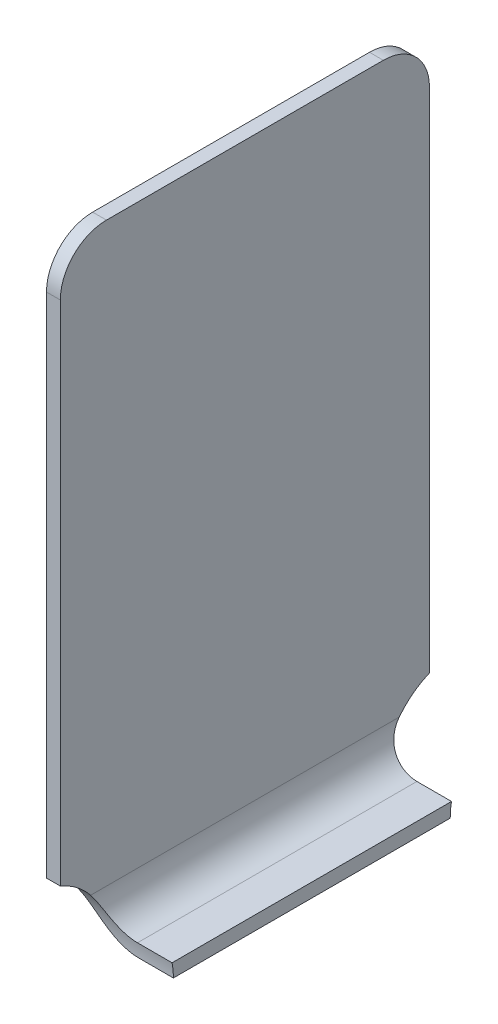
ISO-10303-21;
HEADER;
FILE_DESCRIPTION(('STEP AP214'),'2;1');
FILE_NAME('part.step','',(''),(''),'','','');
FILE_SCHEMA(('AUTOMOTIVE_DESIGN { 1 0 10303 214 1 1 1 1 }'));
ENDSEC;
DATA;
#1=APPLICATION_CONTEXT('core data for automotive mechanical design processes');
#2=APPLICATION_PROTOCOL_DEFINITION('international standard','automotive_design',2000,#1);
#3=PRODUCT_CONTEXT('',#1,'mechanical');
#4=PRODUCT('Part','Part','',(#3));
#5=PRODUCT_RELATED_PRODUCT_CATEGORY('part','',(#4));
#6=PRODUCT_DEFINITION_FORMATION('','',#4);
#7=PRODUCT_DEFINITION_CONTEXT('part definition',#1,'design');
#8=PRODUCT_DEFINITION('design','',#6,#7);
#9=PRODUCT_DEFINITION_SHAPE('','',#8);
#10=(LENGTH_UNIT() NAMED_UNIT(*) SI_UNIT(.MILLI.,.METRE.));
#11=(NAMED_UNIT(*) PLANE_ANGLE_UNIT() SI_UNIT($,.RADIAN.));
#12=(NAMED_UNIT(*) SI_UNIT($,.STERADIAN.) SOLID_ANGLE_UNIT());
#13=UNCERTAINTY_MEASURE_WITH_UNIT(LENGTH_MEASURE(1.E-05),#10,'distance_accuracy_value','');
#14=(GEOMETRIC_REPRESENTATION_CONTEXT(3) GLOBAL_UNCERTAINTY_ASSIGNED_CONTEXT((#13)) GLOBAL_UNIT_ASSIGNED_CONTEXT((#10,
#11,#12)) REPRESENTATION_CONTEXT('',''));
#15=CARTESIAN_POINT('',(0.,0.,0.));
#16=DIRECTION('',(0.,0.,1.));
#17=DIRECTION('',(1.,0.,0.));
#18=AXIS2_PLACEMENT_3D('',#15,#16,#17);
#19=CARTESIAN_POINT('',(-19.05,25.4,101.6));
#20=DIRECTION('',(0.,0.,-1.));
#21=DIRECTION('',(-1.,0.,0.));
#22=AXIS2_PLACEMENT_3D('',#19,#20,#21);
#23=CYLINDRICAL_SURFACE('',#22,25.4);
#24=DIRECTION('',(0.,0.,-1.));
#25=VECTOR('',#24,1.);
#26=CARTESIAN_POINT('',(-19.05,0.,101.6));
#27=LINE('',#26,#25);
#28=CARTESIAN_POINT('',(-19.05,-1.33025439009923E-13,76.2));
#29=VERTEX_POINT('',#28);
#30=CARTESIAN_POINT('',(-19.05,-1.33608677048017E-13,-76.2));
#31=VERTEX_POINT('',#30);
#32=EDGE_CURVE('E165',#29,#31,#27,.T.);
#33=ORIENTED_EDGE('',*,*,#32,.F.);
#34=CARTESIAN_POINT('',(-19.05,0.,76.2));
#35=CARTESIAN_POINT('',(-19.4058604669912,-3.99818767282557E-06,76.2000085447024));
#36=CARTESIAN_POINT('',(-19.7617165575129,0.00747862442081364,76.2000002157662));
#37=CARTESIAN_POINT('',(-20.4727916383045,0.0373849383233621,76.2000119753044));
#38=CARTESIAN_POINT('',(-20.8280106440081,0.0598082626314621,76.2000320630808));
#39=CARTESIAN_POINT('',(-21.5371898011699,0.119562887431094,76.2001628130254));
#40=CARTESIAN_POINT('',(-21.891149991159,0.156893727589279,76.2002734723969));
#41=CARTESIAN_POINT('',(-22.5971648642501,0.246385810547892,76.2007115994245));
#42=CARTESIAN_POINT('',(-22.9492195050621,0.298547381124462,76.2010390718726));
#43=CARTESIAN_POINT('',(-24.0016075762039,0.477168553122185,76.2025819156742));
#44=CARTESIAN_POINT('',(-24.6983702514816,0.625781913440531,76.2043575790274));
#45=CARTESIAN_POINT('',(-25.7319760941839,0.892083648504031,76.2095482547758));
#46=CARTESIAN_POINT('',(-26.0746011904547,0.988085663520027,76.2116998070329));
#47=CARTESIAN_POINT('',(-26.7556113099492,1.19441913479482,76.217156400488));
#48=CARTESIAN_POINT('',(-27.0939951786313,1.30475440376793,76.2204617489975));
#49=CARTESIAN_POINT('',(-28.1020740510156,1.65706946479749,76.2326040456805));
#50=CARTESIAN_POINT('',(-28.7644431074155,1.92029324404411,76.2436664528428));
#51=CARTESIAN_POINT('',(-30.0645453736325,2.50138168319418,76.2748390139916));
#52=CARTESIAN_POINT('',(-30.702279165717,2.81924505069333,76.2949489539926));
#53=CARTESIAN_POINT('',(-31.6367586213954,3.33509034105826,76.3346006416498));
#54=CARTESIAN_POINT('',(-31.9446035552695,3.51357293529548,76.3494015463556));
#55=CARTESIAN_POINT('',(-32.5523052791454,3.88316446858844,76.3826516550618));
#56=CARTESIAN_POINT('',(-32.8521640757731,4.07427019309992,76.4010999326071));
#57=CARTESIAN_POINT('',(-33.7390545353049,4.66605292556287,76.4626733758065));
#58=CARTESIAN_POINT('',(-34.3134821339999,5.08524071105203,76.512030352311));
#59=CARTESIAN_POINT('',(-35.4153324782242,5.96229774323481,76.6305467379873));
#60=CARTESIAN_POINT('',(-35.9433402477889,6.41947647992905,76.6993913859331));
#61=CARTESIAN_POINT('',(-36.9580723195265,7.37374463671383,76.8611157341752));
#62=CARTESIAN_POINT('',(-37.4447969439284,7.87083374523142,76.9539952468483));
#63=CARTESIAN_POINT('',(-38.3726813324744,8.89929947438347,77.1673889517753));
#64=CARTESIAN_POINT('',(-38.8138935643957,9.43063543925661,77.2878707951665));
#65=CARTESIAN_POINT('',(-39.6482272464043,10.5223354709165,77.5598105622308));
#66=CARTESIAN_POINT('',(-40.0413519146246,11.0826975916279,77.7112664112358));
#67=CARTESIAN_POINT('',(-40.7549818698842,12.1915918652438,78.0376525754396));
#68=CARTESIAN_POINT('',(-41.0784328920487,12.7388081588893,78.2106229090268));
#69=CARTESIAN_POINT('',(-41.6795361982953,13.8474396177985,78.5877684755823));
#70=CARTESIAN_POINT('',(-41.9571899471739,14.4088543282723,78.7919427101113));
#71=CARTESIAN_POINT('',(-42.4667784667733,15.5409669752809,79.2326992804494));
#72=CARTESIAN_POINT('',(-42.698632210355,16.1116794645492,79.4693378196006));
#73=CARTESIAN_POINT('',(-43.1165418353192,17.2555305754739,79.9748227098944));
#74=CARTESIAN_POINT('',(-43.302599064099,17.8286691252476,80.2436681131203));
#75=CARTESIAN_POINT('',(-43.6399889275794,19.0055576249662,80.8297886467982));
#76=CARTESIAN_POINT('',(-43.7886309324017,19.6091223267782,81.1489835714224));
#77=CARTESIAN_POINT('',(-44.038783049217,20.8070296876304,81.821594671261));
#78=CARTESIAN_POINT('',(-44.1402776689815,21.4013692534496,82.1750220489305));
#79=CARTESIAN_POINT('',(-44.2992725906046,22.5744325349739,82.9134623686298));
#80=CARTESIAN_POINT('',(-44.3568620559178,23.1531855843938,83.2984095284867));
#81=CARTESIAN_POINT('',(-44.413381420496,24.0070663695045,83.8981113637518));
#82=CARTESIAN_POINT('',(-44.4272440643901,24.2892326920019,84.1016585195467));
#83=CARTESIAN_POINT('',(-44.445552376765,24.8484973068956,84.5159512735735));
#84=CARTESIAN_POINT('',(-44.4499990604821,25.125596142478,84.7266960932575));
#85=CARTESIAN_POINT('',(-44.45,25.4,84.9409313180785));
#86=B_SPLINE_CURVE_WITH_KNOTS('',3,(#34,#35,#36,#37,#38,#39,#40,#41,#42,#43,#44,#45,#46,#47,#48,
#49,#50,#51,#52,#53,#54,#55,#56,#57,#58,#59,#60,#61,#62,#63,#64,#65,#66,#67,#68,#69,#70,#71,#72,
#73,#74,#75,#76,#77,#78,#79,#80,#81,#82,#83,#84,#85),.UNSPECIFIED.,.F.,.F.,(4,2,2,2,2,2,2,2,2,2,
2,2,2,2,2,2,2,2,2,2,2,2,2,2,2,4),(0.,1.06749417924609,2.13496213877739,3.20239713821592,
4.26985573102558,6.40415729560128,7.471389464651,8.53890610612301,10.6747212990819,
12.8104859800026,13.8786466028488,14.9465362541099,17.0820357695184,19.1848390941835,
21.2876260042451,23.3879610231423,25.4881554056783,27.4620219979888,29.4358254451926,
31.4130901762044,33.3902967263792,35.4839565426172,37.5783038318229,39.6683864653526,
40.7127763476837,41.7570536173472),.UNSPECIFIED.);
#87=CARTESIAN_POINT('',(-44.45,25.4,84.9409313180785));
#88=VERTEX_POINT('',#87);
#89=EDGE_CURVE('E149',#29,#88,#86,.T.);
#90=ORIENTED_EDGE('',*,*,#89,.T.);
#91=DIRECTION('',(0.,0.,-1.));
#92=VECTOR('',#91,1.);
#93=CARTESIAN_POINT('',(-44.45,25.4,101.6));
#94=LINE('',#93,#92);
#95=CARTESIAN_POINT('',(-44.45,25.4,-84.9409313180785));
#96=VERTEX_POINT('',#95);
#97=EDGE_CURVE('E168',#88,#96,#94,.T.);
#98=ORIENTED_EDGE('',*,*,#97,.T.);
#99=CARTESIAN_POINT('',(-44.45,25.4,-84.9409313180785));
#100=CARTESIAN_POINT('',(-44.4499990622227,25.1229301559191,-84.7246145568609));
#101=CARTESIAN_POINT('',(-44.4454655284931,24.8431126087548,-84.5118564802428));
#102=CARTESIAN_POINT('',(-44.4267945786798,24.278315491781,-84.0936802890845));
#103=CARTESIAN_POINT('',(-44.4126561089185,23.9933353589659,-83.888262982442));
#104=CARTESIAN_POINT('',(-44.3550037985452,23.1309040470235,-83.2831881427885));
#105=CARTESIAN_POINT('',(-44.296251779251,22.5462900836533,-82.8949637878035));
#106=CARTESIAN_POINT('',(-44.1339536788388,21.3609295516161,-82.1503971112898));
#107=CARTESIAN_POINT('',(-44.0302886407416,20.7601441421794,-81.7941425111673));
#108=CARTESIAN_POINT('',(-43.7747237742043,19.5493010070485,-81.1166242067126));
#109=CARTESIAN_POINT('',(-43.6228375070246,18.9392459341345,-80.7953506987182));
#110=CARTESIAN_POINT('',(-43.267188698042,17.7124907644234,-80.1874085061201));
#111=CARTESIAN_POINT('',(-43.0631458469936,17.0957725736598,-79.9009395508062));
#112=CARTESIAN_POINT('',(-42.6019040033677,15.8658969908008,-79.3653049957744));
#113=CARTESIAN_POINT('',(-42.3447001111382,15.2527399322807,-79.1161428381355));
#114=CARTESIAN_POINT('',(-41.7773004247157,14.0387624681869,-78.6554250132724));
#115=CARTESIAN_POINT('',(-41.4672248964318,13.4379174566631,-78.4437861733906));
#116=CARTESIAN_POINT('',(-40.7944133364744,12.2545197661468,-78.0562223059817));
#117=CARTESIAN_POINT('',(-40.4316819017879,11.6719654957232,-77.8802941640372));
#118=CARTESIAN_POINT('',(-39.6879774949797,10.5799778259368,-77.5753290316197));
#119=CARTESIAN_POINT('',(-39.311084933259,10.0685092503807,-77.4435970151278));
#120=CARTESIAN_POINT('',(-38.5167583340518,9.07176129194729,-77.2060135488693));
#121=CARTESIAN_POINT('',(-38.0993265063473,8.58648048382416,-77.1001606895435));
#122=CARTESIAN_POINT('',(-37.2261908697451,7.64618151621775,-76.9115715708015));
#123=CARTESIAN_POINT('',(-36.7704583482225,7.1911865271328,-76.8288528589077));
#124=CARTESIAN_POINT('',(-35.8239623719803,6.31571841251945,-76.6836495188807));
#125=CARTESIAN_POINT('',(-35.3331977007509,5.89524648691379,-76.6211655938286));
#126=CARTESIAN_POINT('',(-34.3128340716736,5.0865672105156,-76.5125627896104));
#127=CARTESIAN_POINT('',(-33.7827903150793,4.69888926758336,-76.4666833297901));
#128=CARTESIAN_POINT('',(-32.6935606583383,3.96534557462112,-76.3892636906378));
#129=CARTESIAN_POINT('',(-32.1343750063051,3.61947946868918,-76.3577233892447));
#130=CARTESIAN_POINT('',(-30.990321673176,2.97187255229096,-76.305846510945));
#131=CARTESIAN_POINT('',(-30.4054469725403,2.67014390116273,-76.2855130171253));
#132=CARTESIAN_POINT('',(-29.2138366678371,2.11289801146712,-76.2531709512431));
#133=CARTESIAN_POINT('',(-28.6070993869358,1.85738432661884,-76.2411630191771));
#134=CARTESIAN_POINT('',(-27.2792440898947,1.35799059182693,-76.221472944738));
#135=CARTESIAN_POINT('',(-26.5550700424232,1.1221701165344,-76.2147601954235));
#136=CARTESIAN_POINT('',(-25.0882522006034,0.716432613908641,-76.2057175713364));
#137=CARTESIAN_POINT('',(-24.3456053796474,0.54652646277602,-76.203388419636));
#138=CARTESIAN_POINT('',(-23.2221789441249,0.34210189996557,-76.2013640102179));
#139=CARTESIAN_POINT('',(-22.845829127382,0.282339177637477,-76.2009343339699));
#140=CARTESIAN_POINT('',(-22.0907922723583,0.179796268567795,-76.2003592507816));
#141=CARTESIAN_POINT('',(-21.7121052250101,0.137016147753977,-76.2002138449448));
#142=CARTESIAN_POINT('',(-20.9532345562955,0.0685407514215133,-76.2000420830656));
#143=CARTESIAN_POINT('',(-20.5730510865517,0.0428437876360308,-76.2000157152576));
#144=CARTESIAN_POINT('',(-19.8119130714342,0.00857062816471142,-76.2000002958573));
#145=CARTESIAN_POINT('',(-19.4309585256405,-5.55819232937862E-06,-76.2000112442854));
#146=CARTESIAN_POINT('',(-19.05,0.,-76.2));
#147=B_SPLINE_CURVE_WITH_KNOTS('',3,(#99,#100,#101,#102,#103,#104,#105,#106,#107,#108,#109,#110,
#111,#112,#113,#114,#115,#116,#117,#118,#119,#120,#121,#122,#123,#124,#125,#126,#127,#128,#129,
#130,#131,#132,#133,#134,#135,#136,#137,#138,#139,#140,#141,#142,#143,#144,#145,#146),
.UNSPECIFIED.,.F.,.F.,(4,2,2,2,2,2,2,2,2,2,2,2,2,2,2,2,2,2,2,2,2,2,2,4),(0.,1.05442143081471,
2.10895855212016,4.21927826754719,6.33522189366081,8.45057097909075,10.577536969678,
12.7046990821527,14.8270856066615,16.9492869530411,18.8935267635449,20.8376606535938,
22.7832652170924,24.7289373756275,26.7016406930403,28.6743272176401,30.6475561743081,
32.6209367987919,34.9027377809192,37.1849151119012,38.3277943839846,39.4706780927703,
40.6134488376811,41.7562202052665),.UNSPECIFIED.);
#148=EDGE_CURVE('E136',#96,#31,#147,.T.);
#149=ORIENTED_EDGE('',*,*,#148,.T.);
#150=EDGE_LOOP('',(#33,#90,#98,#149));
#151=FACE_BOUND('',#150,.T.);
#152=ADVANCED_FACE('F36',(#151),#23,.T.);
#153=CARTESIAN_POINT('',(0.,0.,101.6));
#154=DIRECTION('',(0.,-1.,0.));
#155=DIRECTION('',(1.,0.,0.));
#156=AXIS2_PLACEMENT_3D('',#153,#154,#155);
#157=PLANE('',#156);
#158=DIRECTION('',(0.,0.,-1.));
#159=VECTOR('',#158,1.);
#160=CARTESIAN_POINT('',(0.,0.,101.6));
#161=LINE('',#160,#159);
#162=CARTESIAN_POINT('',(0.,0.,76.2));
#163=VERTEX_POINT('',#162);
#164=CARTESIAN_POINT('',(0.,0.,-76.2));
#165=VERTEX_POINT('',#164);
#166=EDGE_CURVE('E162',#163,#165,#161,.T.);
#167=ORIENTED_EDGE('',*,*,#166,.F.);
#168=DIRECTION('',(-1.,0.,0.));
#169=VECTOR('',#168,1.);
#170=CARTESIAN_POINT('',(15.494,1.08194023728071E-13,76.2));
#171=LINE('',#170,#169);
#172=EDGE_CURVE('E261',#163,#29,#171,.T.);
#173=ORIENTED_EDGE('',*,*,#172,.T.);
#174=ORIENTED_EDGE('',*,*,#32,.T.);
#175=DIRECTION('',(-1.,0.,0.));
#176=VECTOR('',#175,1.);
#177=CARTESIAN_POINT('',(15.494,1.07610785689977E-13,-76.2));
#178=LINE('',#177,#176);
#179=EDGE_CURVE('E262',#165,#31,#178,.T.);
#180=ORIENTED_EDGE('',*,*,#179,.F.);
#181=EDGE_LOOP('',(#167,#173,#174,#180));
#182=FACE_BOUND('',#181,.T.);
#183=ADVANCED_FACE('F277',(#182),#157,.T.);
#184=CARTESIAN_POINT('',(0.,7.62,101.6));
#185=DIRECTION('',(0.,-1.,0.));
#186=DIRECTION('',(1.,0.,0.));
#187=AXIS2_PLACEMENT_3D('',#184,#185,#186);
#188=PLANE('',#187);
#189=DIRECTION('',(-1.,0.,0.));
#190=VECTOR('',#189,1.);
#191=CARTESIAN_POINT('',(15.494,7.62,76.9094823156415));
#192=LINE('',#191,#190);
#193=CARTESIAN_POINT('',(0.,7.61999999999989,76.9094823156415));
#194=VERTEX_POINT('',#193);
#195=CARTESIAN_POINT('',(-19.05,7.61999999999999,76.9094823156415));
#196=VERTEX_POINT('',#195);
#197=EDGE_CURVE('E240',#194,#196,#192,.T.);
#198=ORIENTED_EDGE('',*,*,#197,.F.);
#199=DIRECTION('',(0.,0.,-1.));
#200=VECTOR('',#199,1.);
#201=CARTESIAN_POINT('',(0.,7.62,101.6));
#202=LINE('',#201,#200);
#203=CARTESIAN_POINT('',(0.,7.61999999999989,-76.9094823156415));
#204=VERTEX_POINT('',#203);
#205=EDGE_CURVE('E159',#194,#204,#202,.T.);
#206=ORIENTED_EDGE('',*,*,#205,.T.);
#207=DIRECTION('',(-1.,0.,0.));
#208=VECTOR('',#207,1.);
#209=CARTESIAN_POINT('',(15.494,7.62,-76.9094823156415));
#210=LINE('',#209,#208);
#211=CARTESIAN_POINT('',(-19.05,7.61999999999999,-76.9094823156416));
#212=VERTEX_POINT('',#211);
#213=EDGE_CURVE('E260',#212,#204,#210,.F.);
#214=ORIENTED_EDGE('',*,*,#213,.F.);
#215=DIRECTION('',(0.,0.,-1.));
#216=VECTOR('',#215,1.);
#217=CARTESIAN_POINT('',(-19.05,7.62,101.6));
#218=LINE('',#217,#216);
#219=EDGE_CURVE('E156',#196,#212,#218,.T.);
#220=ORIENTED_EDGE('',*,*,#219,.F.);
#221=EDGE_LOOP('',(#198,#206,#214,#220));
#222=FACE_BOUND('',#221,.T.);
#223=ADVANCED_FACE('F248',(#222),#188,.F.);
#224=CARTESIAN_POINT('',(-19.05,25.4,101.6));
#225=DIRECTION('',(0.,0.,-1.));
#226=DIRECTION('',(-1.,0.,0.));
#227=AXIS2_PLACEMENT_3D('',#224,#225,#226);
#228=CYLINDRICAL_SURFACE('',#227,17.78);
#229=CARTESIAN_POINT('',(-19.05,7.61999999999999,76.9094823156415));
#230=CARTESIAN_POINT('',(-19.2942894095382,7.6199994696691,76.9094853312332));
#231=CARTESIAN_POINT('',(-19.5385520114656,7.62503527107007,76.9104277833517));
#232=CARTESIAN_POINT('',(-20.0266424224001,7.64516307917796,76.9142152538409));
#233=CARTESIAN_POINT('',(-20.2704702407234,7.66025486775096,76.9170602309422));
#234=CARTESIAN_POINT('',(-21.0006419727368,7.72058128758197,76.9284829260646));
#235=CARTESIAN_POINT('',(-21.4857785624024,7.78086698756763,76.9399483891584));
#236=CARTESIAN_POINT('',(-22.4490743982116,7.94110440557016,76.9710356029954));
#237=CARTESIAN_POINT('',(-22.9272352907584,8.04104660153792,76.9906553958298));
#238=CARTESIAN_POINT('',(-23.6366471945034,8.22005252207045,77.0267615290221));
#239=CARTESIAN_POINT('',(-23.8718209296318,8.28457267077213,77.0399102182185));
#240=CARTESIAN_POINT('',(-24.3392476054409,8.42320104399232,77.0685608656341));
#241=CARTESIAN_POINT('',(-24.5714997610689,8.49731178764822,77.0840634423293));
#242=CARTESIAN_POINT('',(-25.2634317336576,8.73388763912516,77.1343139620392));
#243=CARTESIAN_POINT('',(-25.7180770916625,8.91054333460548,77.172794276618));
#244=CARTESIAN_POINT('',(-26.6104227570531,9.30014258768608,77.2609128485328));
#245=CARTESIAN_POINT('',(-27.0481233108983,9.51308561724915,77.310550943509));
#246=CARTESIAN_POINT('',(-27.6894478068297,9.85820695686321,77.3943892764249));
#247=CARTESIAN_POINT('',(-27.9006923673049,9.97753670601984,77.4239001706197));
#248=CARTESIAN_POINT('',(-28.3177116551167,10.2244725808471,77.4862265113175));
#249=CARTESIAN_POINT('',(-28.5234877650964,10.3520765858383,77.5190411122674));
#250=CARTESIAN_POINT('',(-29.1321536375243,10.7469333239809,77.622733716684));
#251=CARTESIAN_POINT('',(-29.526431713386,11.0262581394219,77.6988670478972));
#252=CARTESIAN_POINT('',(-30.2849468614593,11.6111840327542,77.8656889290942));
#253=CARTESIAN_POINT('',(-30.6494529080943,11.9164828100258,77.956218465982));
#254=CARTESIAN_POINT('',(-31.3504985011162,12.5528141488799,78.1537155374263));
#255=CARTESIAN_POINT('',(-31.6870382912849,12.8838464860944,78.2606829286709));
#256=CARTESIAN_POINT('',(-32.329798243202,13.5680286556429,78.4921252957492));
#257=CARTESIAN_POINT('',(-32.6360374859579,13.9211643372216,78.6165891325333));
#258=CARTESIAN_POINT('',(-33.2167523750223,14.6460613209877,78.883968531169));
#259=CARTESIAN_POINT('',(-33.4912283994655,15.0178224013681,79.0268838733163));
#260=CARTESIAN_POINT('',(-34.0042085619179,15.7716325176742,79.3299572328028));
#261=CARTESIAN_POINT('',(-34.2430972731608,16.1535094737383,79.4898930581165));
#262=CARTESIAN_POINT('',(-34.688105072054,16.9278404097658,79.828587124485));
#263=CARTESIAN_POINT('',(-34.894224107353,17.3202944066254,80.0073453956088));
#264=CARTESIAN_POINT('',(-35.2739803659549,18.1127324840901,80.3839320702557));
#265=CARTESIAN_POINT('',(-35.4475575090307,18.5127290209681,80.5817947447965));
#266=CARTESIAN_POINT('',(-35.7622239337836,19.3159189751621,80.9958951458418));
#267=CARTESIAN_POINT('',(-35.903313573868,19.7191123571591,81.2121326695959));
#268=CARTESIAN_POINT('',(-36.1687751318653,20.5731153933133,81.6889822477917));
#269=CARTESIAN_POINT('',(-36.2891935315515,21.023914186736,81.9518174156295));
#270=CARTESIAN_POINT('',(-36.492456235873,21.9213566923388,82.4984931577518));
#271=CARTESIAN_POINT('',(-36.5752868080377,22.3679988276325,82.7823413650342));
#272=CARTESIAN_POINT('',(-36.705418681485,23.2520819130922,83.3685980553548));
#273=CARTESIAN_POINT('',(-36.7528352822955,23.6895481760437,83.6709428084985));
#274=CARTESIAN_POINT('',(-36.7995497256067,24.3375619320376,84.1376395041215));
#275=CARTESIAN_POINT('',(-36.811053042067,24.5521269030767,84.2953428578067));
#276=CARTESIAN_POINT('',(-36.8262771279555,24.978320265058,84.6149925206591));
#277=CARTESIAN_POINT('',(-36.8299987001795,25.1899489566807,84.7769383904058));
#278=CARTESIAN_POINT('',(-36.83,25.4,84.9409313180785));
#279=B_SPLINE_CURVE_WITH_KNOTS('',3,(#229,#230,#231,#232,#233,#234,#235,#236,#237,#238,#239,
#240,#241,#242,#243,#244,#245,#246,#247,#248,#249,#250,#251,#252,#253,#254,#255,#256,#257,#258,
#259,#260,#261,#262,#263,#264,#265,#266,#267,#268,#269,#270,#271,#272,#273,#274,#275,#276,#277,
#278),.UNSPECIFIED.,.F.,.F.,(4,2,2,2,2,2,2,2,2,2,2,2,2,2,2,2,2,2,2,2,2,2,2,2,4),(0.,
0.732760950099154,1.46550600570682,2.93068392643388,4.39551025125078,5.12797413263532,
5.8606308004617,7.32659244446709,8.79253275826941,9.52555656081585,10.2583932274121,
11.7238930132212,13.1742057093105,14.6245057617089,16.0738866325732,17.5232502470791,
18.9555937353118,20.3879395117656,21.8229042502875,23.2578531572883,24.8625931132101,
26.4679188794572,28.0679950234741,28.8674609576207,29.6668444115919),.UNSPECIFIED.);
#280=CARTESIAN_POINT('',(-36.83,25.4,84.9409313180785));
#281=VERTEX_POINT('',#280);
#282=EDGE_CURVE('E232',#196,#281,#279,.T.);
#283=ORIENTED_EDGE('',*,*,#282,.F.);
#284=ORIENTED_EDGE('',*,*,#219,.T.);
#285=CARTESIAN_POINT('',(-36.83,25.4,-84.9409313180785));
#286=CARTESIAN_POINT('',(-36.8299984137115,25.1774493441378,-84.7671791513843));
#287=CARTESIAN_POINT('',(-36.825820786949,24.9531276753188,-84.5957256513913));
#288=CARTESIAN_POINT('',(-36.8087086097687,24.5012049947589,-84.2575915259645));
#289=CARTESIAN_POINT('',(-36.7957730067298,24.2736035920454,-84.090911476762));
#290=CARTESIAN_POINT('',(-36.7431972073342,23.5860141810897,-83.5981125870336));
#291=CARTESIAN_POINT('',(-36.6897868099332,23.1215728350993,-83.2794940205504));
#292=CARTESIAN_POINT('',(-36.5428623335567,22.1820128478806,-82.6626250285776));
#293=CARTESIAN_POINT('',(-36.4491407083662,21.7068511765486,-82.3644894031478));
#294=CARTESIAN_POINT('',(-36.2188917469539,20.7526013398405,-81.792167745318));
#295=CARTESIAN_POINT('',(-36.0823777632928,20.2735144446081,-81.5179742762886));
#296=CARTESIAN_POINT('',(-35.7633927990924,19.3132532208268,-80.9931526085564));
#297=CARTESIAN_POINT('',(-35.580628130748,18.8320856344058,-80.7426896202299));
#298=CARTESIAN_POINT('',(-35.1682520475626,17.8766325539147,-80.2683321005342));
#299=CARTESIAN_POINT('',(-34.9386356284293,17.4023478008097,-80.0444404113215));
#300=CARTESIAN_POINT('',(-34.4330626392904,16.4685503257471,-79.624321804869));
#301=CARTESIAN_POINT('',(-34.1572522275822,16.0089962947672,-79.4280111149392));
#302=CARTESIAN_POINT('',(-33.5596185015293,15.1096783367824,-79.0619954949299));
#303=CARTESIAN_POINT('',(-33.237802426871,14.6699113102821,-78.8922863874821));
#304=CARTESIAN_POINT('',(-32.5931267295257,13.869948673379,-78.5981623759576));
#305=CARTESIAN_POINT('',(-32.2754346567156,13.5066812527609,-78.4707370962271));
#306=CARTESIAN_POINT('',(-31.6081889550009,12.8041710801837,-78.2345087695951));
#307=CARTESIAN_POINT('',(-31.2586378900211,12.4649263988376,-78.1257042261718));
#308=CARTESIAN_POINT('',(-30.5297637142046,11.8138890560825,-77.9253628242459));
#309=CARTESIAN_POINT('',(-30.1504182162665,11.5021174180483,-77.8338391295219));
#310=CARTESIAN_POINT('',(-29.364955210723,10.9095860324411,-77.6666923482277));
#311=CARTESIAN_POINT('',(-28.9588380664406,10.628825864144,-77.5910690459287));
#312=CARTESIAN_POINT('',(-28.1402394444157,10.1120811750719,-77.4570073227752));
#313=CARTESIAN_POINT('',(-27.7287185977046,9.87472357363509,-77.3979867685339));
#314=CARTESIAN_POINT('',(-26.8867802285177,9.43318379153227,-77.2917664515054));
#315=CARTESIAN_POINT('',(-26.4563625450133,9.22900189364135,-77.2445667894724));
#316=CARTESIAN_POINT('',(-25.579873135276,8.85563573506253,-77.1607351737857));
#317=CARTESIAN_POINT('',(-25.1338089599187,8.6864348573659,-77.1240981992678));
#318=CARTESIAN_POINT('',(-24.2289587730167,8.38429501988017,-77.0602365619915));
#319=CARTESIAN_POINT('',(-23.7701747741285,8.25135035894187,-77.0330104192361));
#320=CARTESIAN_POINT('',(-22.9588980283256,8.05130367659641,-76.9927851499946));
#321=CARTESIAN_POINT('',(-22.6084803157477,7.97604990874188,-76.9779310351295));
#322=CARTESIAN_POINT('',(-21.903625191946,7.84683610270937,-76.9526961070654));
#323=CARTESIAN_POINT('',(-21.5491884663463,7.79287248712643,-76.9423145423124));
#324=CARTESIAN_POINT('',(-20.8379975993285,7.70650944667843,-76.9258030212481));
#325=CARTESIAN_POINT('',(-20.4812464125642,7.67408652847512,-76.9196684326687));
#326=CARTESIAN_POINT('',(-19.7663312802843,7.63082211925406,-76.9115158020574));
#327=CARTESIAN_POINT('',(-19.4081671090585,7.61998422871369,-76.9094984467966));
#328=CARTESIAN_POINT('',(-19.05,7.61999999999999,-76.9094823156415));
#329=B_SPLINE_CURVE_WITH_KNOTS('',3,(#285,#286,#287,#288,#289,#290,#291,#292,#293,#294,#295,
#296,#297,#298,#299,#300,#301,#302,#303,#304,#305,#306,#307,#308,#309,#310,#311,#312,#313,#314,
#315,#316,#317,#318,#319,#320,#321,#322,#323,#324,#325,#326,#327,#328),.UNSPECIFIED.,.F.,.F.,(4,
2,2,2,2,2,2,2,2,2,2,2,2,2,2,2,2,2,2,2,2,4),(0.,0.846944525641789,1.69399086360834,
3.38934322673568,5.09353076826323,6.79718707816147,8.51194549848485,10.2268871701982,
11.9365018516163,13.6458477948751,15.1413424635459,16.636716884976,18.1332258603126,
19.6297145304278,21.0642082004266,22.498714096776,23.9325369871207,25.3661342842161,
26.4416370645253,27.5169590500113,28.5911063029617,29.6654327133886),.UNSPECIFIED.);
#330=CARTESIAN_POINT('',(-36.83,25.4,-84.9409313180785));
#331=VERTEX_POINT('',#330);
#332=EDGE_CURVE('E253',#331,#212,#329,.T.);
#333=ORIENTED_EDGE('',*,*,#332,.F.);
#334=DIRECTION('',(0.,0.,-1.));
#335=VECTOR('',#334,1.);
#336=CARTESIAN_POINT('',(-36.83,25.4,101.6));
#337=LINE('',#336,#335);
#338=EDGE_CURVE('E135',#281,#331,#337,.T.);
#339=ORIENTED_EDGE('',*,*,#338,.F.);
#340=EDGE_LOOP('',(#283,#284,#333,#339));
#341=FACE_BOUND('',#340,.T.);
#342=ADVANCED_FACE('F242',(#341),#228,.F.);
#343=CARTESIAN_POINT('',(-19.05,25.4,101.6));
#344=DIRECTION('',(0.,0.,-1.));
#345=DIRECTION('',(-1.,0.,0.));
#346=AXIS2_PLACEMENT_3D('',#343,#344,#345);
#347=PLANE('',#346);
#348=DIRECTION('',(-1.,0.,0.));
#349=VECTOR('',#348,1.);
#350=CARTESIAN_POINT('',(15.4939999999997,38.1000000000001,101.6));
#351=LINE('',#350,#349);
#352=CARTESIAN_POINT('',(-36.83,38.0999999999999,101.6));
#353=VERTEX_POINT('',#352);
#354=CARTESIAN_POINT('',(-44.45,38.0999999999997,101.6));
#355=VERTEX_POINT('',#354);
#356=EDGE_CURVE('E11',#353,#355,#351,.T.);
#357=ORIENTED_EDGE('',*,*,#356,.F.);
#358=DIRECTION('',(0.,1.,0.));
#359=VECTOR('',#358,1.);
#360=CARTESIAN_POINT('',(-36.83,25.4,101.6));
#361=LINE('',#360,#359);
#362=CARTESIAN_POINT('',(-36.83,317.5,101.6));
#363=VERTEX_POINT('',#362);
#364=EDGE_CURVE('E146',#353,#363,#361,.T.);
#365=ORIENTED_EDGE('',*,*,#364,.T.);
#366=DIRECTION('',(1.,0.,0.));
#367=VECTOR('',#366,1.);
#368=CARTESIAN_POINT('',(-44.45,317.5,101.6));
#369=LINE('',#368,#367);
#370=CARTESIAN_POINT('',(-44.45,317.5,101.6));
#371=VERTEX_POINT('',#370);
#372=EDGE_CURVE('E183',#363,#371,#369,.F.);
#373=ORIENTED_EDGE('',*,*,#372,.T.);
#374=DIRECTION('',(0.,1.,0.));
#375=VECTOR('',#374,1.);
#376=CARTESIAN_POINT('',(-44.45,25.4,101.6));
#377=LINE('',#376,#375);
#378=EDGE_CURVE('E152',#355,#371,#377,.T.);
#379=ORIENTED_EDGE('',*,*,#378,.F.);
#380=EDGE_LOOP('',(#357,#365,#373,#379));
#381=FACE_BOUND('',#380,.T.);
#382=ADVANCED_FACE('F247',(#381),#347,.F.);
#383=CARTESIAN_POINT('',(-19.05,25.4,-101.6));
#384=DIRECTION('',(0.,0.,-1.));
#385=DIRECTION('',(-1.,0.,0.));
#386=AXIS2_PLACEMENT_3D('',#383,#384,#385);
#387=PLANE('',#386);
#388=DIRECTION('',(0.,1.,0.));
#389=VECTOR('',#388,1.);
#390=CARTESIAN_POINT('',(-36.83,25.4,-101.6));
#391=LINE('',#390,#389);
#392=CARTESIAN_POINT('',(-36.83,38.0999999999997,-101.6));
#393=VERTEX_POINT('',#392);
#394=CARTESIAN_POINT('',(-36.83,317.5,-101.6));
#395=VERTEX_POINT('',#394);
#396=EDGE_CURVE('E132',#393,#395,#391,.T.);
#397=ORIENTED_EDGE('',*,*,#396,.F.);
#398=DIRECTION('',(-1.,0.,0.));
#399=VECTOR('',#398,1.);
#400=CARTESIAN_POINT('',(15.4939999999997,38.1000000000001,-101.6));
#401=LINE('',#400,#399);
#402=CARTESIAN_POINT('',(-44.45,38.0999999999998,-101.6));
#403=VERTEX_POINT('',#402);
#404=EDGE_CURVE('E44',#393,#403,#401,.T.);
#405=ORIENTED_EDGE('',*,*,#404,.T.);
#406=DIRECTION('',(0.,1.,0.));
#407=VECTOR('',#406,1.);
#408=CARTESIAN_POINT('',(-44.45,25.4,-101.6));
#409=LINE('',#408,#407);
#410=CARTESIAN_POINT('',(-44.45,317.5,-101.6));
#411=VERTEX_POINT('',#410);
#412=EDGE_CURVE('E143',#403,#411,#409,.T.);
#413=ORIENTED_EDGE('',*,*,#412,.T.);
#414=DIRECTION('',(1.,0.,0.));
#415=VECTOR('',#414,1.);
#416=CARTESIAN_POINT('',(-19.05,317.5,-101.6));
#417=LINE('',#416,#415);
#418=EDGE_CURVE('E142',#411,#395,#417,.T.);
#419=ORIENTED_EDGE('',*,*,#418,.T.);
#420=EDGE_LOOP('',(#397,#405,#413,#419));
#421=FACE_BOUND('',#420,.T.);
#422=ADVANCED_FACE('F140',(#421),#387,.T.);
#423=CARTESIAN_POINT('',(-36.83,25.4,101.6));
#424=DIRECTION('',(-1.,0.,0.));
#425=DIRECTION('',(0.,0.,1.));
#426=AXIS2_PLACEMENT_3D('',#423,#424,#425);
#427=PLANE('',#426);
#428=CARTESIAN_POINT('',(-36.83,-2.57182515419185E-13,117.475));
#429=DIRECTION('',(-1.,0.,0.));
#430=DIRECTION('',(0.,0.,1.));
#431=AXIS2_PLACEMENT_3D('',#428,#429,#430);
#432=CIRCLE('',#431,41.275);
#433=EDGE_CURVE('E50',#281,#353,#432,.F.);
#434=ORIENTED_EDGE('',*,*,#433,.F.);
#435=ORIENTED_EDGE('',*,*,#338,.T.);
#436=CARTESIAN_POINT('',(-36.83,-2.55238388625539E-13,-117.475));
#437=DIRECTION('',(-1.,0.,0.));
#438=DIRECTION('',(0.,0.,1.));
#439=AXIS2_PLACEMENT_3D('',#436,#437,#438);
#440=CIRCLE('',#439,41.275);
#441=EDGE_CURVE('E123',#393,#331,#440,.F.);
#442=ORIENTED_EDGE('',*,*,#441,.F.);
#443=ORIENTED_EDGE('',*,*,#396,.T.);
#444=CARTESIAN_POINT('',(-36.83,317.5,-76.2));
#445=DIRECTION('',(-1.,0.,0.));
#446=DIRECTION('',(0.,0.,1.));
#447=AXIS2_PLACEMENT_3D('',#444,#445,#446);
#448=CIRCLE('',#447,25.4);
#449=CARTESIAN_POINT('',(-36.83,342.9,-76.2));
#450=VERTEX_POINT('',#449);
#451=EDGE_CURVE('E189',#395,#450,#448,.F.);
#452=ORIENTED_EDGE('',*,*,#451,.T.);
#453=DIRECTION('',(0.,0.,-1.));
#454=VECTOR('',#453,1.);
#455=CARTESIAN_POINT('',(-36.83,342.9,101.6));
#456=LINE('',#455,#454);
#457=CARTESIAN_POINT('',(-36.83,342.9,76.2));
#458=VERTEX_POINT('',#457);
#459=EDGE_CURVE('E174',#458,#450,#456,.T.);
#460=ORIENTED_EDGE('',*,*,#459,.F.);
#461=CARTESIAN_POINT('',(-36.83,317.5,76.2));
#462=DIRECTION('',(-1.,0.,0.));
#463=DIRECTION('',(0.,0.,1.));
#464=AXIS2_PLACEMENT_3D('',#461,#462,#463);
#465=CIRCLE('',#464,25.4);
#466=EDGE_CURVE('E180',#458,#363,#465,.F.);
#467=ORIENTED_EDGE('',*,*,#466,.T.);
#468=ORIENTED_EDGE('',*,*,#364,.F.);
#469=EDGE_LOOP('',(#434,#435,#442,#443,#452,#460,#467,#468));
#470=FACE_BOUND('',#469,.T.);
#471=ADVANCED_FACE('F131',(#470),#427,.F.);
#472=CARTESIAN_POINT('',(-44.45,342.9,101.6));
#473=DIRECTION('',(0.,1.,0.));
#474=DIRECTION('',(0.,0.,1.));
#475=AXIS2_PLACEMENT_3D('',#472,#473,#474);
#476=PLANE('',#475);
#477=ORIENTED_EDGE('',*,*,#459,.T.);
#478=DIRECTION('',(1.,0.,0.));
#479=VECTOR('',#478,1.);
#480=CARTESIAN_POINT('',(-44.45,342.9,-76.2));
#481=LINE('',#480,#479);
#482=CARTESIAN_POINT('',(-44.45,342.9,-76.2));
#483=VERTEX_POINT('',#482);
#484=EDGE_CURVE('E191',#450,#483,#481,.F.);
#485=ORIENTED_EDGE('',*,*,#484,.T.);
#486=DIRECTION('',(0.,0.,-1.));
#487=VECTOR('',#486,1.);
#488=CARTESIAN_POINT('',(-44.45,342.9,101.6));
#489=LINE('',#488,#487);
#490=CARTESIAN_POINT('',(-44.45,342.9,76.2));
#491=VERTEX_POINT('',#490);
#492=EDGE_CURVE('E171',#491,#483,#489,.T.);
#493=ORIENTED_EDGE('',*,*,#492,.F.);
#494=DIRECTION('',(1.,0.,0.));
#495=VECTOR('',#494,1.);
#496=CARTESIAN_POINT('',(-36.83,342.9,76.2));
#497=LINE('',#496,#495);
#498=EDGE_CURVE('E177',#491,#458,#497,.T.);
#499=ORIENTED_EDGE('',*,*,#498,.T.);
#500=EDGE_LOOP('',(#477,#485,#493,#499));
#501=FACE_BOUND('',#500,.T.);
#502=ADVANCED_FACE('F203',(#501),#476,.T.);
#503=CARTESIAN_POINT('',(-44.45,25.4,101.6));
#504=DIRECTION('',(-1.,0.,0.));
#505=DIRECTION('',(0.,0.,1.));
#506=AXIS2_PLACEMENT_3D('',#503,#504,#505);
#507=PLANE('',#506);
#508=ORIENTED_EDGE('',*,*,#97,.F.);
#509=CARTESIAN_POINT('',(-44.45,-3.10392691023155E-13,117.475));
#510=DIRECTION('',(-1.,0.,0.));
#511=DIRECTION('',(0.,0.,1.));
#512=AXIS2_PLACEMENT_3D('',#509,#510,#511);
#513=CIRCLE('',#512,41.275);
#514=EDGE_CURVE('E144',#88,#355,#513,.F.);
#515=ORIENTED_EDGE('',*,*,#514,.T.);
#516=ORIENTED_EDGE('',*,*,#378,.T.);
#517=CARTESIAN_POINT('',(-44.45,317.5,76.2));
#518=DIRECTION('',(-1.,0.,0.));
#519=DIRECTION('',(0.,0.,1.));
#520=AXIS2_PLACEMENT_3D('',#517,#518,#519);
#521=CIRCLE('',#520,25.4);
#522=EDGE_CURVE('E186',#371,#491,#521,.T.);
#523=ORIENTED_EDGE('',*,*,#522,.T.);
#524=ORIENTED_EDGE('',*,*,#492,.T.);
#525=CARTESIAN_POINT('',(-44.45,317.5,-76.2));
#526=DIRECTION('',(-1.,0.,0.));
#527=DIRECTION('',(0.,0.,1.));
#528=AXIS2_PLACEMENT_3D('',#525,#526,#527);
#529=CIRCLE('',#528,25.4);
#530=EDGE_CURVE('E128',#483,#411,#529,.T.);
#531=ORIENTED_EDGE('',*,*,#530,.T.);
#532=ORIENTED_EDGE('',*,*,#412,.F.);
#533=CARTESIAN_POINT('',(-44.45,-3.08448564229508E-13,-117.475));
#534=DIRECTION('',(-1.,0.,0.));
#535=DIRECTION('',(0.,0.,1.));
#536=AXIS2_PLACEMENT_3D('',#533,#534,#535);
#537=CIRCLE('',#536,41.275);
#538=EDGE_CURVE('E58',#403,#96,#537,.F.);
#539=ORIENTED_EDGE('',*,*,#538,.T.);
#540=EDGE_LOOP('',(#508,#515,#516,#523,#524,#531,#532,#539));
#541=FACE_BOUND('',#540,.T.);
#542=ADVANCED_FACE('F197',(#541),#507,.T.);
#543=CARTESIAN_POINT('',(0.,7.62,101.6));
#544=DIRECTION('',(1.,0.,0.));
#545=DIRECTION('',(0.,1.,0.));
#546=AXIS2_PLACEMENT_3D('',#543,#544,#545);
#547=PLANE('',#546);
#548=ORIENTED_EDGE('',*,*,#205,.F.);
#549=CARTESIAN_POINT('',(0.,0.,117.475));
#550=DIRECTION('',(1.,0.,0.));
#551=DIRECTION('',(0.,1.,0.));
#552=AXIS2_PLACEMENT_3D('',#549,#550,#551);
#553=CIRCLE('',#552,41.275);
#554=EDGE_CURVE('E282',#194,#163,#553,.F.);
#555=ORIENTED_EDGE('',*,*,#554,.T.);
#556=ORIENTED_EDGE('',*,*,#166,.T.);
#557=CARTESIAN_POINT('',(0.,0.,-117.475));
#558=DIRECTION('',(1.,0.,0.));
#559=DIRECTION('',(0.,1.,0.));
#560=AXIS2_PLACEMENT_3D('',#557,#558,#559);
#561=CIRCLE('',#560,41.275);
#562=EDGE_CURVE('E137',#165,#204,#561,.F.);
#563=ORIENTED_EDGE('',*,*,#562,.T.);
#564=EDGE_LOOP('',(#548,#555,#556,#563));
#565=FACE_BOUND('',#564,.T.);
#566=ADVANCED_FACE('F281',(#565),#547,.T.);
#567=CARTESIAN_POINT('',(-44.45,317.5,76.2));
#568=DIRECTION('',(-1.,0.,0.));
#569=DIRECTION('',(0.,0.,1.));
#570=AXIS2_PLACEMENT_3D('',#567,#568,#569);
#571=CYLINDRICAL_SURFACE('',#570,25.4);
#572=ORIENTED_EDGE('',*,*,#522,.F.);
#573=ORIENTED_EDGE('',*,*,#372,.F.);
#574=ORIENTED_EDGE('',*,*,#466,.F.);
#575=ORIENTED_EDGE('',*,*,#498,.F.);
#576=EDGE_LOOP('',(#572,#573,#574,#575));
#577=FACE_BOUND('',#576,.T.);
#578=ADVANCED_FACE('F207',(#577),#571,.T.);
#579=CARTESIAN_POINT('',(-19.05,317.5,-76.2));
#580=DIRECTION('',(1.,0.,0.));
#581=DIRECTION('',(0.,0.,-1.));
#582=AXIS2_PLACEMENT_3D('',#579,#580,#581);
#583=CYLINDRICAL_SURFACE('',#582,25.4);
#584=ORIENTED_EDGE('',*,*,#530,.F.);
#585=ORIENTED_EDGE('',*,*,#484,.F.);
#586=ORIENTED_EDGE('',*,*,#451,.F.);
#587=ORIENTED_EDGE('',*,*,#418,.F.);
#588=EDGE_LOOP('',(#584,#585,#586,#587));
#589=FACE_BOUND('',#588,.T.);
#590=ADVANCED_FACE('F38',(#589),#583,.T.);
#591=CARTESIAN_POINT('',(15.494,1.10138150521717E-13,-117.475));
#592=DIRECTION('',(-1.,0.,0.));
#593=DIRECTION('',(0.,-1.,0.));
#594=AXIS2_PLACEMENT_3D('',#591,#592,#593);
#595=CYLINDRICAL_SURFACE('',#594,41.275);
#596=ORIENTED_EDGE('',*,*,#404,.F.);
#597=ORIENTED_EDGE('',*,*,#441,.T.);
#598=ORIENTED_EDGE('',*,*,#332,.T.);
#599=ORIENTED_EDGE('',*,*,#213,.T.);
#600=ORIENTED_EDGE('',*,*,#562,.F.);
#601=ORIENTED_EDGE('',*,*,#179,.T.);
#602=ORIENTED_EDGE('',*,*,#148,.F.);
#603=ORIENTED_EDGE('',*,*,#538,.F.);
#604=EDGE_LOOP('',(#596,#597,#598,#599,#600,#601,#602,#603));
#605=FACE_BOUND('',#604,.T.);
#606=ADVANCED_FACE('F122',(#605),#595,.F.);
#607=CARTESIAN_POINT('',(15.494,1.08194023728071E-13,117.475));
#608=DIRECTION('',(-1.,0.,0.));
#609=DIRECTION('',(0.,-1.,0.));
#610=AXIS2_PLACEMENT_3D('',#607,#608,#609);
#611=CYLINDRICAL_SURFACE('',#610,41.275);
#612=ORIENTED_EDGE('',*,*,#89,.F.);
#613=ORIENTED_EDGE('',*,*,#172,.F.);
#614=ORIENTED_EDGE('',*,*,#554,.F.);
#615=ORIENTED_EDGE('',*,*,#197,.T.);
#616=ORIENTED_EDGE('',*,*,#282,.T.);
#617=ORIENTED_EDGE('',*,*,#433,.T.);
#618=ORIENTED_EDGE('',*,*,#356,.T.);
#619=ORIENTED_EDGE('',*,*,#514,.F.);
#620=EDGE_LOOP('',(#612,#613,#614,#615,#616,#617,#618,#619));
#621=FACE_BOUND('',#620,.T.);
#622=ADVANCED_FACE('F224',(#621),#611,.F.);
#623=CLOSED_SHELL('',(#152,#183,#223,#342,#382,#422,#471,#502,#542,#566,#578,#590,#606,#622));
#624=MANIFOLD_SOLID_BREP('B2',#623);
#625=ADVANCED_BREP_SHAPE_REPRESENTATION('',(#18,#624),#14);
#626=SHAPE_DEFINITION_REPRESENTATION(#9,#625);
ENDSEC;
END-ISO-10303-21;
